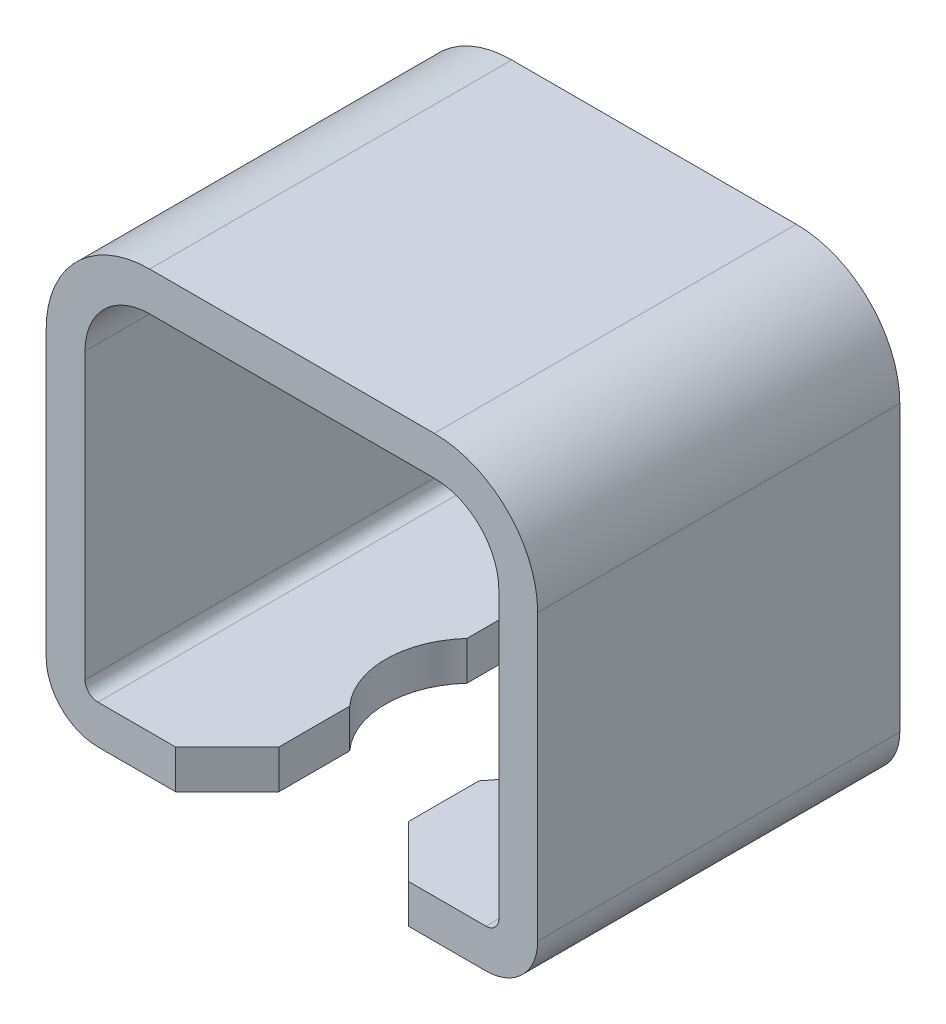
ISO-10303-21;
HEADER;
FILE_DESCRIPTION(('STEP AP214'),'2;1');
FILE_NAME('part.step','',(''),(''),'','','');
FILE_SCHEMA(('AUTOMOTIVE_DESIGN { 1 0 10303 214 1 1 1 1 }'));
ENDSEC;
DATA;
#1=APPLICATION_CONTEXT('core data for automotive mechanical design processes');
#2=APPLICATION_PROTOCOL_DEFINITION('international standard','automotive_design',2000,#1);
#3=PRODUCT_CONTEXT('',#1,'mechanical');
#4=PRODUCT('Part','Part','',(#3));
#5=PRODUCT_RELATED_PRODUCT_CATEGORY('part','',(#4));
#6=PRODUCT_DEFINITION_FORMATION('','',#4);
#7=PRODUCT_DEFINITION_CONTEXT('part definition',#1,'design');
#8=PRODUCT_DEFINITION('design','',#6,#7);
#9=PRODUCT_DEFINITION_SHAPE('','',#8);
#10=(LENGTH_UNIT() NAMED_UNIT(*) SI_UNIT(.MILLI.,.METRE.));
#11=(NAMED_UNIT(*) PLANE_ANGLE_UNIT() SI_UNIT($,.RADIAN.));
#12=(NAMED_UNIT(*) SI_UNIT($,.STERADIAN.) SOLID_ANGLE_UNIT());
#13=UNCERTAINTY_MEASURE_WITH_UNIT(LENGTH_MEASURE(1.E-05),#10,'distance_accuracy_value','');
#14=(GEOMETRIC_REPRESENTATION_CONTEXT(3) GLOBAL_UNCERTAINTY_ASSIGNED_CONTEXT((#13)) GLOBAL_UNIT_ASSIGNED_CONTEXT((#10,
#11,#12)) REPRESENTATION_CONTEXT('',''));
#15=CARTESIAN_POINT('',(0.,0.,0.));
#16=DIRECTION('',(0.,0.,1.));
#17=DIRECTION('',(1.,0.,0.));
#18=AXIS2_PLACEMENT_3D('',#15,#16,#17);
#19=CARTESIAN_POINT('',(-5.5,4.5,-7.));
#20=DIRECTION('',(0.,0.,1.));
#21=DIRECTION('',(1.,0.,0.));
#22=AXIS2_PLACEMENT_3D('',#19,#20,#21);
#23=PLANE('',#22);
#24=DIRECTION('',(1.,0.,0.));
#25=VECTOR('',#24,1.);
#26=CARTESIAN_POINT('',(7.49999999999999,-7.,-7.));
#27=LINE('',#26,#25);
#28=CARTESIAN_POINT('',(-7.49999999999999,-7.,-7.));
#29=VERTEX_POINT('',#28);
#30=CARTESIAN_POINT('',(-4.5,-7.,-7.));
#31=VERTEX_POINT('',#30);
#32=EDGE_CURVE('E379',#29,#31,#27,.T.);
#33=ORIENTED_EDGE('',*,*,#32,.T.);
#34=DIRECTION('',(0.,-1.,0.));
#35=VECTOR('',#34,1.);
#36=CARTESIAN_POINT('',(-4.5,4.5,-7.));
#37=LINE('',#36,#35);
#38=CARTESIAN_POINT('',(-4.5,-8.5,-7.));
#39=VERTEX_POINT('',#38);
#40=EDGE_CURVE('E513',#31,#39,#37,.T.);
#41=ORIENTED_EDGE('',*,*,#40,.T.);
#42=DIRECTION('',(1.,0.,0.));
#43=VECTOR('',#42,1.);
#44=CARTESIAN_POINT('',(7.49999999999999,-8.5,-7.));
#45=LINE('',#44,#43);
#46=CARTESIAN_POINT('',(-7.49999999999998,-8.5,-7.));
#47=VERTEX_POINT('',#46);
#48=EDGE_CURVE('E464',#47,#39,#45,.T.);
#49=ORIENTED_EDGE('',*,*,#48,.F.);
#50=CARTESIAN_POINT('',(-7.5,-6.5,-7.));
#51=DIRECTION('',(0.,0.,1.));
#52=DIRECTION('',(-1.,0.,0.));
#53=AXIS2_PLACEMENT_3D('',#50,#51,#52);
#54=CIRCLE('',#53,2.);
#55=CARTESIAN_POINT('',(-9.5,-6.5,-7.));
#56=VERTEX_POINT('',#55);
#57=EDGE_CURVE('E460',#56,#47,#54,.T.);
#58=ORIENTED_EDGE('',*,*,#57,.F.);
#59=DIRECTION('',(0.,-1.,0.));
#60=VECTOR('',#59,1.);
#61=CARTESIAN_POINT('',(-9.5,-6.49999999999999,-7.));
#62=LINE('',#61,#60);
#63=CARTESIAN_POINT('',(-9.5,4.49999999999997,-7.));
#64=VERTEX_POINT('',#63);
#65=EDGE_CURVE('E457',#64,#56,#62,.T.);
#66=ORIENTED_EDGE('',*,*,#65,.F.);
#67=CARTESIAN_POINT('',(-5.5,4.5,-7.));
#68=DIRECTION('',(0.,0.,1.));
#69=DIRECTION('',(1.,0.,0.));
#70=AXIS2_PLACEMENT_3D('',#67,#68,#69);
#71=CIRCLE('',#70,4.);
#72=CARTESIAN_POINT('',(-5.49999999999997,8.5,-7.));
#73=VERTEX_POINT('',#72);
#74=EDGE_CURVE('E424',#73,#64,#71,.T.);
#75=ORIENTED_EDGE('',*,*,#74,.F.);
#76=DIRECTION('',(-1.,0.,0.));
#77=VECTOR('',#76,1.);
#78=CARTESIAN_POINT('',(5.49999999999997,8.5,-7.));
#79=LINE('',#78,#77);
#80=CARTESIAN_POINT('',(5.49999999999997,8.5,-7.));
#81=VERTEX_POINT('',#80);
#82=EDGE_CURVE('E430',#81,#73,#79,.T.);
#83=ORIENTED_EDGE('',*,*,#82,.F.);
#84=CARTESIAN_POINT('',(5.5,4.5,-7.));
#85=DIRECTION('',(0.,0.,1.));
#86=DIRECTION('',(1.,0.,0.));
#87=AXIS2_PLACEMENT_3D('',#84,#85,#86);
#88=CIRCLE('',#87,4.);
#89=CARTESIAN_POINT('',(9.5,4.49999999999997,-7.));
#90=VERTEX_POINT('',#89);
#91=EDGE_CURVE('E474',#90,#81,#88,.T.);
#92=ORIENTED_EDGE('',*,*,#91,.F.);
#93=DIRECTION('',(0.,1.,0.));
#94=VECTOR('',#93,1.);
#95=CARTESIAN_POINT('',(9.5,-6.49999999999999,-7.));
#96=LINE('',#95,#94);
#97=CARTESIAN_POINT('',(9.5,-6.49999999999999,-7.));
#98=VERTEX_POINT('',#97);
#99=EDGE_CURVE('E471',#98,#90,#96,.T.);
#100=ORIENTED_EDGE('',*,*,#99,.F.);
#101=CARTESIAN_POINT('',(7.5,-6.5,-7.));
#102=DIRECTION('',(0.,0.,1.));
#103=DIRECTION('',(1.,0.,0.));
#104=AXIS2_PLACEMENT_3D('',#101,#102,#103);
#105=CIRCLE('',#104,2.);
#106=CARTESIAN_POINT('',(7.49999999999999,-8.5,-7.));
#107=VERTEX_POINT('',#106);
#108=EDGE_CURVE('E468',#107,#98,#105,.T.);
#109=ORIENTED_EDGE('',*,*,#108,.F.);
#110=CARTESIAN_POINT('',(4.50000000000001,-8.5,-7.));
#111=VERTEX_POINT('',#110);
#112=EDGE_CURVE('E463',#111,#107,#45,.T.);
#113=ORIENTED_EDGE('',*,*,#112,.F.);
#114=DIRECTION('',(0.,1.,0.));
#115=VECTOR('',#114,1.);
#116=CARTESIAN_POINT('',(4.50000000000001,-7.,-7.));
#117=LINE('',#116,#115);
#118=CARTESIAN_POINT('',(4.50000000000001,-7.,-7.));
#119=VERTEX_POINT('',#118);
#120=EDGE_CURVE('E510',#111,#119,#117,.T.);
#121=ORIENTED_EDGE('',*,*,#120,.T.);
#122=CARTESIAN_POINT('',(7.49999999999999,-7.,-7.));
#123=VERTEX_POINT('',#122);
#124=EDGE_CURVE('E378',#119,#123,#27,.T.);
#125=ORIENTED_EDGE('',*,*,#124,.T.);
#126=CARTESIAN_POINT('',(7.5,-6.5,-7.));
#127=DIRECTION('',(0.,0.,1.));
#128=DIRECTION('',(1.,0.,0.));
#129=AXIS2_PLACEMENT_3D('',#126,#127,#128);
#130=CIRCLE('',#129,0.5);
#131=CARTESIAN_POINT('',(8.,-6.5,-7.));
#132=VERTEX_POINT('',#131);
#133=EDGE_CURVE('E383',#123,#132,#130,.T.);
#134=ORIENTED_EDGE('',*,*,#133,.T.);
#135=DIRECTION('',(0.,1.,0.));
#136=VECTOR('',#135,1.);
#137=CARTESIAN_POINT('',(8.,-6.49999999999999,-7.));
#138=LINE('',#137,#136);
#139=CARTESIAN_POINT('',(8.,4.49999999999997,-7.));
#140=VERTEX_POINT('',#139);
#141=EDGE_CURVE('E387',#132,#140,#138,.T.);
#142=ORIENTED_EDGE('',*,*,#141,.T.);
#143=CARTESIAN_POINT('',(5.5,4.5,-7.));
#144=DIRECTION('',(0.,0.,1.));
#145=DIRECTION('',(1.,0.,0.));
#146=AXIS2_PLACEMENT_3D('',#143,#144,#145);
#147=CIRCLE('',#146,2.5);
#148=CARTESIAN_POINT('',(5.49999999999998,7.,-7.));
#149=VERTEX_POINT('',#148);
#150=EDGE_CURVE('E391',#140,#149,#147,.T.);
#151=ORIENTED_EDGE('',*,*,#150,.T.);
#152=DIRECTION('',(-1.,0.,0.));
#153=VECTOR('',#152,1.);
#154=CARTESIAN_POINT('',(5.49999999999997,7.,-7.));
#155=LINE('',#154,#153);
#156=CARTESIAN_POINT('',(-5.49999999999997,7.,-7.));
#157=VERTEX_POINT('',#156);
#158=EDGE_CURVE('E342',#149,#157,#155,.T.);
#159=ORIENTED_EDGE('',*,*,#158,.T.);
#160=CARTESIAN_POINT('',(-5.5,4.5,-7.));
#161=DIRECTION('',(0.,0.,1.));
#162=DIRECTION('',(1.,0.,0.));
#163=AXIS2_PLACEMENT_3D('',#160,#161,#162);
#164=CIRCLE('',#163,2.5);
#165=CARTESIAN_POINT('',(-8.,4.49999999999997,-7.));
#166=VERTEX_POINT('',#165);
#167=EDGE_CURVE('E277',#157,#166,#164,.T.);
#168=ORIENTED_EDGE('',*,*,#167,.T.);
#169=DIRECTION('',(0.,-1.,0.));
#170=VECTOR('',#169,1.);
#171=CARTESIAN_POINT('',(-8.,-6.49999999999999,-7.));
#172=LINE('',#171,#170);
#173=CARTESIAN_POINT('',(-8.,-6.5,-7.));
#174=VERTEX_POINT('',#173);
#175=EDGE_CURVE('E370',#166,#174,#172,.T.);
#176=ORIENTED_EDGE('',*,*,#175,.T.);
#177=CARTESIAN_POINT('',(-7.5,-6.5,-7.));
#178=DIRECTION('',(0.,0.,1.));
#179=DIRECTION('',(1.,0.,0.));
#180=AXIS2_PLACEMENT_3D('',#177,#178,#179);
#181=CIRCLE('',#180,0.5);
#182=EDGE_CURVE('E374',#174,#29,#181,.T.);
#183=ORIENTED_EDGE('',*,*,#182,.T.);
#184=EDGE_LOOP('',(#33,#41,#49,#58,#66,#75,#83,#92,#100,#109,#113,#121,#125,#134,#142,#151,#159,
#168,#176,#183));
#185=FACE_BOUND('',#184,.T.);
#186=ADVANCED_FACE('F87',(#185),#23,.F.);
#187=CARTESIAN_POINT('',(7.49999999999999,-8.5,7.));
#188=DIRECTION('',(0.,1.,0.));
#189=DIRECTION('',(-1.,0.,0.));
#190=AXIS2_PLACEMENT_3D('',#187,#188,#189);
#191=PLANE('',#190);
#192=DIRECTION('',(0.,0.,-1.));
#193=VECTOR('',#192,1.);
#194=CARTESIAN_POINT('',(2.5,-8.5,0.));
#195=LINE('',#194,#193);
#196=CARTESIAN_POINT('',(2.5,-8.5,-2.26729464340213));
#197=VERTEX_POINT('',#196);
#198=CARTESIAN_POINT('',(2.5,-8.5,-5.));
#199=VERTEX_POINT('',#198);
#200=EDGE_CURVE('E289',#197,#199,#195,.T.);
#201=ORIENTED_EDGE('',*,*,#200,.T.);
#202=DIRECTION('',(0.707106781186549,0.,-0.707106781186546));
#203=VECTOR('',#202,1.);
#204=CARTESIAN_POINT('',(2.5,-8.5,-5.));
#205=LINE('',#204,#203);
#206=EDGE_CURVE('E539',#199,#111,#205,.T.);
#207=ORIENTED_EDGE('',*,*,#206,.T.);
#208=ORIENTED_EDGE('',*,*,#112,.T.);
#209=DIRECTION('',(0.,0.,-1.));
#210=VECTOR('',#209,1.);
#211=CARTESIAN_POINT('',(7.49999999999999,-8.5,7.));
#212=LINE('',#211,#210);
#213=CARTESIAN_POINT('',(7.49999999999999,-8.5,7.));
#214=VERTEX_POINT('',#213);
#215=EDGE_CURVE('E494',#214,#107,#212,.T.);
#216=ORIENTED_EDGE('',*,*,#215,.F.);
#217=DIRECTION('',(1.,0.,0.));
#218=VECTOR('',#217,1.);
#219=CARTESIAN_POINT('',(7.49999999999999,-8.5,7.));
#220=LINE('',#219,#218);
#221=CARTESIAN_POINT('',(4.5,-8.5,7.));
#222=VERTEX_POINT('',#221);
#223=EDGE_CURVE('E436',#222,#214,#220,.T.);
#224=ORIENTED_EDGE('',*,*,#223,.F.);
#225=DIRECTION('',(0.707106781186546,0.,0.707106781186549));
#226=VECTOR('',#225,1.);
#227=CARTESIAN_POINT('',(4.5,-8.5,7.));
#228=LINE('',#227,#226);
#229=CARTESIAN_POINT('',(2.5,-8.5,4.99999999999999));
#230=VERTEX_POINT('',#229);
#231=EDGE_CURVE('E536',#222,#230,#228,.F.);
#232=ORIENTED_EDGE('',*,*,#231,.T.);
#233=DIRECTION('',(0.,0.,-1.));
#234=VECTOR('',#233,1.);
#235=CARTESIAN_POINT('',(2.5,-8.5,0.));
#236=LINE('',#235,#234);
#237=CARTESIAN_POINT('',(2.5,-8.5,2.26729464340213));
#238=VERTEX_POINT('',#237);
#239=EDGE_CURVE('E313',#230,#238,#236,.T.);
#240=ORIENTED_EDGE('',*,*,#239,.T.);
#241=CARTESIAN_POINT('',(0.,-8.5,0.));
#242=DIRECTION('',(0.,-1.,0.));
#243=DIRECTION('',(1.,0.,0.));
#244=AXIS2_PLACEMENT_3D('',#241,#242,#243);
#245=CIRCLE('',#244,3.375);
#246=EDGE_CURVE('E286',#197,#238,#245,.T.);
#247=ORIENTED_EDGE('',*,*,#246,.F.);
#248=EDGE_LOOP('',(#201,#207,#208,#216,#224,#232,#240,#247));
#249=FACE_BOUND('',#248,.T.);
#250=ADVANCED_FACE('F635',(#249),#191,.F.);
#251=CARTESIAN_POINT('',(7.49999999999999,-7.,7.));
#252=DIRECTION('',(0.,1.,0.));
#253=DIRECTION('',(-1.,0.,0.));
#254=AXIS2_PLACEMENT_3D('',#251,#252,#253);
#255=PLANE('',#254);
#256=ORIENTED_EDGE('',*,*,#124,.F.);
#257=DIRECTION('',(-0.707106781186549,0.,0.707106781186546));
#258=VECTOR('',#257,1.);
#259=CARTESIAN_POINT('',(-0.999999999999996,-7.,-1.50000000000003));
#260=LINE('',#259,#258);
#261=CARTESIAN_POINT('',(2.5,-7.,-5.));
#262=VERTEX_POINT('',#261);
#263=EDGE_CURVE('E544',#119,#262,#260,.T.);
#264=ORIENTED_EDGE('',*,*,#263,.T.);
#265=DIRECTION('',(0.,0.,-1.));
#266=VECTOR('',#265,1.);
#267=CARTESIAN_POINT('',(2.5,-7.,0.));
#268=LINE('',#267,#266);
#269=CARTESIAN_POINT('',(2.5,-7.,-2.26729464340213));
#270=VERTEX_POINT('',#269);
#271=EDGE_CURVE('E294',#270,#262,#268,.T.);
#272=ORIENTED_EDGE('',*,*,#271,.F.);
#273=CARTESIAN_POINT('',(0.,-7.,0.));
#274=DIRECTION('',(0.,1.,0.));
#275=DIRECTION('',(-1.,0.,0.));
#276=AXIS2_PLACEMENT_3D('',#273,#274,#275);
#277=CIRCLE('',#276,3.375);
#278=CARTESIAN_POINT('',(2.5,-7.,2.26729464340213));
#279=VERTEX_POINT('',#278);
#280=EDGE_CURVE('E283',#270,#279,#277,.F.);
#281=ORIENTED_EDGE('',*,*,#280,.T.);
#282=DIRECTION('',(0.,0.,-1.));
#283=VECTOR('',#282,1.);
#284=CARTESIAN_POINT('',(2.5,-7.,0.));
#285=LINE('',#284,#283);
#286=CARTESIAN_POINT('',(2.5,-7.,4.99999999999999));
#287=VERTEX_POINT('',#286);
#288=EDGE_CURVE('E270',#287,#279,#285,.T.);
#289=ORIENTED_EDGE('',*,*,#288,.F.);
#290=DIRECTION('',(-0.707106781186546,0.,-0.707106781186549));
#291=VECTOR('',#290,1.);
#292=CARTESIAN_POINT('',(5.99999999999999,-7.,8.49999999999999));
#293=LINE('',#292,#291);
#294=CARTESIAN_POINT('',(4.5,-7.,7.));
#295=VERTEX_POINT('',#294);
#296=EDGE_CURVE('E103',#287,#295,#293,.F.);
#297=ORIENTED_EDGE('',*,*,#296,.T.);
#298=DIRECTION('',(1.,0.,0.));
#299=VECTOR('',#298,1.);
#300=CARTESIAN_POINT('',(7.49999999999999,-7.,7.));
#301=LINE('',#300,#299);
#302=CARTESIAN_POINT('',(7.49999999999999,-7.,7.));
#303=VERTEX_POINT('',#302);
#304=EDGE_CURVE('E348',#295,#303,#301,.T.);
#305=ORIENTED_EDGE('',*,*,#304,.T.);
#306=DIRECTION('',(0.,0.,-1.));
#307=VECTOR('',#306,1.);
#308=CARTESIAN_POINT('',(7.49999999999999,-7.,7.));
#309=LINE('',#308,#307);
#310=EDGE_CURVE('E410',#303,#123,#309,.T.);
#311=ORIENTED_EDGE('',*,*,#310,.T.);
#312=EDGE_LOOP('',(#256,#264,#272,#281,#289,#297,#305,#311));
#313=FACE_BOUND('',#312,.T.);
#314=ADVANCED_FACE('F292',(#313),#255,.T.);
#315=CARTESIAN_POINT('',(-5.5,4.5,7.));
#316=DIRECTION('',(0.,0.,1.));
#317=DIRECTION('',(1.,0.,0.));
#318=AXIS2_PLACEMENT_3D('',#315,#316,#317);
#319=PLANE('',#318);
#320=CARTESIAN_POINT('',(-7.49999999999998,-8.5,7.));
#321=VERTEX_POINT('',#320);
#322=CARTESIAN_POINT('',(-4.50000000000001,-8.5,7.));
#323=VERTEX_POINT('',#322);
#324=EDGE_CURVE('E437',#321,#323,#220,.T.);
#325=ORIENTED_EDGE('',*,*,#324,.T.);
#326=DIRECTION('',(0.,1.,0.));
#327=VECTOR('',#326,1.);
#328=CARTESIAN_POINT('',(-4.50000000000001,-7.,7.));
#329=LINE('',#328,#327);
#330=CARTESIAN_POINT('',(-4.50000000000001,-7.,7.));
#331=VERTEX_POINT('',#330);
#332=EDGE_CURVE('E96',#323,#331,#329,.T.);
#333=ORIENTED_EDGE('',*,*,#332,.T.);
#334=CARTESIAN_POINT('',(-7.49999999999999,-7.,7.));
#335=VERTEX_POINT('',#334);
#336=EDGE_CURVE('E349',#335,#331,#301,.T.);
#337=ORIENTED_EDGE('',*,*,#336,.F.);
#338=CARTESIAN_POINT('',(-7.5,-6.5,7.));
#339=DIRECTION('',(0.,0.,1.));
#340=DIRECTION('',(1.,0.,0.));
#341=AXIS2_PLACEMENT_3D('',#338,#339,#340);
#342=CIRCLE('',#341,0.5);
#343=CARTESIAN_POINT('',(-8.,-6.5,7.));
#344=VERTEX_POINT('',#343);
#345=EDGE_CURVE('E345',#344,#335,#342,.T.);
#346=ORIENTED_EDGE('',*,*,#345,.F.);
#347=DIRECTION('',(0.,-1.,0.));
#348=VECTOR('',#347,1.);
#349=CARTESIAN_POINT('',(-8.,-6.49999999999999,7.));
#350=LINE('',#349,#348);
#351=CARTESIAN_POINT('',(-8.,4.49999999999997,7.));
#352=VERTEX_POINT('',#351);
#353=EDGE_CURVE('E341',#352,#344,#350,.T.);
#354=ORIENTED_EDGE('',*,*,#353,.F.);
#355=CARTESIAN_POINT('',(-5.5,4.5,7.));
#356=DIRECTION('',(0.,0.,1.));
#357=DIRECTION('',(1.,0.,0.));
#358=AXIS2_PLACEMENT_3D('',#355,#356,#357);
#359=CIRCLE('',#358,2.5);
#360=CARTESIAN_POINT('',(-5.49999999999997,7.,7.));
#361=VERTEX_POINT('',#360);
#362=EDGE_CURVE('E338',#361,#352,#359,.T.);
#363=ORIENTED_EDGE('',*,*,#362,.F.);
#364=DIRECTION('',(-1.,0.,0.));
#365=VECTOR('',#364,1.);
#366=CARTESIAN_POINT('',(5.49999999999997,7.,7.));
#367=LINE('',#366,#365);
#368=CARTESIAN_POINT('',(5.49999999999998,7.,7.));
#369=VERTEX_POINT('',#368);
#370=EDGE_CURVE('E363',#369,#361,#367,.T.);
#371=ORIENTED_EDGE('',*,*,#370,.F.);
#372=CARTESIAN_POINT('',(5.5,4.5,7.));
#373=DIRECTION('',(0.,0.,1.));
#374=DIRECTION('',(1.,0.,0.));
#375=AXIS2_PLACEMENT_3D('',#372,#373,#374);
#376=CIRCLE('',#375,2.5);
#377=CARTESIAN_POINT('',(8.,4.49999999999997,7.));
#378=VERTEX_POINT('',#377);
#379=EDGE_CURVE('E359',#378,#369,#376,.T.);
#380=ORIENTED_EDGE('',*,*,#379,.F.);
#381=DIRECTION('',(0.,1.,0.));
#382=VECTOR('',#381,1.);
#383=CARTESIAN_POINT('',(8.,-6.49999999999999,7.));
#384=LINE('',#383,#382);
#385=CARTESIAN_POINT('',(8.,-6.5,7.));
#386=VERTEX_POINT('',#385);
#387=EDGE_CURVE('E356',#386,#378,#384,.T.);
#388=ORIENTED_EDGE('',*,*,#387,.F.);
#389=CARTESIAN_POINT('',(7.5,-6.5,7.));
#390=DIRECTION('',(0.,0.,1.));
#391=DIRECTION('',(1.,0.,0.));
#392=AXIS2_PLACEMENT_3D('',#389,#390,#391);
#393=CIRCLE('',#392,0.5);
#394=EDGE_CURVE('E353',#303,#386,#393,.T.);
#395=ORIENTED_EDGE('',*,*,#394,.F.);
#396=ORIENTED_EDGE('',*,*,#304,.F.);
#397=DIRECTION('',(0.,-1.,0.));
#398=VECTOR('',#397,1.);
#399=CARTESIAN_POINT('',(4.5,4.5,7.));
#400=LINE('',#399,#398);
#401=EDGE_CURVE('E551',#295,#222,#400,.T.);
#402=ORIENTED_EDGE('',*,*,#401,.T.);
#403=ORIENTED_EDGE('',*,*,#223,.T.);
#404=CARTESIAN_POINT('',(7.5,-6.5,7.));
#405=DIRECTION('',(0.,0.,1.));
#406=DIRECTION('',(1.,0.,0.));
#407=AXIS2_PLACEMENT_3D('',#404,#405,#406);
#408=CIRCLE('',#407,2.);
#409=CARTESIAN_POINT('',(9.5,-6.49999999999999,7.));
#410=VERTEX_POINT('',#409);
#411=EDGE_CURVE('E441',#214,#410,#408,.T.);
#412=ORIENTED_EDGE('',*,*,#411,.T.);
#413=DIRECTION('',(0.,1.,0.));
#414=VECTOR('',#413,1.);
#415=CARTESIAN_POINT('',(9.5,-6.49999999999999,7.));
#416=LINE('',#415,#414);
#417=CARTESIAN_POINT('',(9.5,4.49999999999997,7.));
#418=VERTEX_POINT('',#417);
#419=EDGE_CURVE('E444',#410,#418,#416,.T.);
#420=ORIENTED_EDGE('',*,*,#419,.T.);
#421=CARTESIAN_POINT('',(5.5,4.5,7.));
#422=DIRECTION('',(0.,0.,1.));
#423=DIRECTION('',(1.,0.,0.));
#424=AXIS2_PLACEMENT_3D('',#421,#422,#423);
#425=CIRCLE('',#424,4.);
#426=CARTESIAN_POINT('',(5.49999999999997,8.5,7.));
#427=VERTEX_POINT('',#426);
#428=EDGE_CURVE('E447',#418,#427,#425,.T.);
#429=ORIENTED_EDGE('',*,*,#428,.T.);
#430=DIRECTION('',(-1.,0.,0.));
#431=VECTOR('',#430,1.);
#432=CARTESIAN_POINT('',(5.49999999999997,8.5,7.));
#433=LINE('',#432,#431);
#434=CARTESIAN_POINT('',(-5.49999999999997,8.5,7.));
#435=VERTEX_POINT('',#434);
#436=EDGE_CURVE('E450',#427,#435,#433,.T.);
#437=ORIENTED_EDGE('',*,*,#436,.T.);
#438=CARTESIAN_POINT('',(-5.5,4.5,7.));
#439=DIRECTION('',(0.,0.,1.));
#440=DIRECTION('',(1.,0.,0.));
#441=AXIS2_PLACEMENT_3D('',#438,#439,#440);
#442=CIRCLE('',#441,4.);
#443=CARTESIAN_POINT('',(-9.5,4.49999999999997,7.));
#444=VERTEX_POINT('',#443);
#445=EDGE_CURVE('E425',#435,#444,#442,.T.);
#446=ORIENTED_EDGE('',*,*,#445,.T.);
#447=DIRECTION('',(0.,-1.,0.));
#448=VECTOR('',#447,1.);
#449=CARTESIAN_POINT('',(-9.5,-6.49999999999999,7.));
#450=LINE('',#449,#448);
#451=CARTESIAN_POINT('',(-9.5,-6.5,7.));
#452=VERTEX_POINT('',#451);
#453=EDGE_CURVE('E429',#444,#452,#450,.T.);
#454=ORIENTED_EDGE('',*,*,#453,.T.);
#455=CARTESIAN_POINT('',(-7.5,-6.5,7.));
#456=DIRECTION('',(0.,0.,1.));
#457=DIRECTION('',(-1.,0.,0.));
#458=AXIS2_PLACEMENT_3D('',#455,#456,#457);
#459=CIRCLE('',#458,2.);
#460=EDGE_CURVE('E433',#452,#321,#459,.T.);
#461=ORIENTED_EDGE('',*,*,#460,.T.);
#462=EDGE_LOOP('',(#325,#333,#337,#346,#354,#363,#371,#380,#388,#395,#396,#402,#403,#412,#420,
#429,#437,#446,#454,#461));
#463=FACE_BOUND('',#462,.T.);
#464=ADVANCED_FACE('F558',(#463),#319,.T.);
#465=CARTESIAN_POINT('',(-5.5,4.5,7.));
#466=DIRECTION('',(0.,0.,-1.));
#467=DIRECTION('',(-1.,0.,0.));
#468=AXIS2_PLACEMENT_3D('',#465,#466,#467);
#469=CYLINDRICAL_SURFACE('',#468,4.);
#470=ORIENTED_EDGE('',*,*,#74,.T.);
#471=DIRECTION('',(0.,0.,-1.));
#472=VECTOR('',#471,1.);
#473=CARTESIAN_POINT('',(-9.5,4.49999999999997,7.));
#474=LINE('',#473,#472);
#475=EDGE_CURVE('E506',#444,#64,#474,.T.);
#476=ORIENTED_EDGE('',*,*,#475,.F.);
#477=ORIENTED_EDGE('',*,*,#445,.F.);
#478=DIRECTION('',(0.,0.,-1.));
#479=VECTOR('',#478,1.);
#480=CARTESIAN_POINT('',(-5.49999999999997,8.5,7.));
#481=LINE('',#480,#479);
#482=EDGE_CURVE('E453',#435,#73,#481,.T.);
#483=ORIENTED_EDGE('',*,*,#482,.T.);
#484=EDGE_LOOP('',(#470,#476,#477,#483));
#485=FACE_BOUND('',#484,.T.);
#486=ADVANCED_FACE('F603',(#485),#469,.T.);
#487=CARTESIAN_POINT('',(-9.5,-6.49999999999999,7.));
#488=DIRECTION('',(1.,0.,0.));
#489=DIRECTION('',(0.,0.,-1.));
#490=AXIS2_PLACEMENT_3D('',#487,#488,#489);
#491=PLANE('',#490);
#492=ORIENTED_EDGE('',*,*,#65,.T.);
#493=DIRECTION('',(0.,0.,-1.));
#494=VECTOR('',#493,1.);
#495=CARTESIAN_POINT('',(-9.5,-6.5,7.));
#496=LINE('',#495,#494);
#497=EDGE_CURVE('E502',#452,#56,#496,.T.);
#498=ORIENTED_EDGE('',*,*,#497,.F.);
#499=ORIENTED_EDGE('',*,*,#453,.F.);
#500=ORIENTED_EDGE('',*,*,#475,.T.);
#501=EDGE_LOOP('',(#492,#498,#499,#500));
#502=FACE_BOUND('',#501,.T.);
#503=ADVANCED_FACE('F600',(#502),#491,.F.);
#504=CARTESIAN_POINT('',(-7.5,-6.5,7.));
#505=DIRECTION('',(0.,0.,-1.));
#506=DIRECTION('',(-1.,0.,0.));
#507=AXIS2_PLACEMENT_3D('',#504,#505,#506);
#508=CYLINDRICAL_SURFACE('',#507,2.);
#509=ORIENTED_EDGE('',*,*,#57,.T.);
#510=DIRECTION('',(0.,0.,-1.));
#511=VECTOR('',#510,1.);
#512=CARTESIAN_POINT('',(-7.49999999999998,-8.5,7.));
#513=LINE('',#512,#511);
#514=EDGE_CURVE('E498',#321,#47,#513,.T.);
#515=ORIENTED_EDGE('',*,*,#514,.F.);
#516=ORIENTED_EDGE('',*,*,#460,.F.);
#517=ORIENTED_EDGE('',*,*,#497,.T.);
#518=EDGE_LOOP('',(#509,#515,#516,#517));
#519=FACE_BOUND('',#518,.T.);
#520=ADVANCED_FACE('F594',(#519),#508,.T.);
#521=ORIENTED_EDGE('',*,*,#48,.T.);
#522=DIRECTION('',(-0.707106781186546,0.,-0.707106781186549));
#523=VECTOR('',#522,1.);
#524=CARTESIAN_POINT('',(-4.5,-8.5,-7.));
#525=LINE('',#524,#523);
#526=CARTESIAN_POINT('',(-2.5,-8.5,-4.99999999999999));
#527=VERTEX_POINT('',#526);
#528=EDGE_CURVE('E520',#39,#527,#525,.F.);
#529=ORIENTED_EDGE('',*,*,#528,.T.);
#530=DIRECTION('',(0.,0.,-1.));
#531=VECTOR('',#530,1.);
#532=CARTESIAN_POINT('',(-2.5,-8.5,0.));
#533=LINE('',#532,#531);
#534=CARTESIAN_POINT('',(-2.5,-8.5,-2.26729464340213));
#535=VERTEX_POINT('',#534);
#536=EDGE_CURVE('E323',#535,#527,#533,.T.);
#537=ORIENTED_EDGE('',*,*,#536,.F.);
#538=CARTESIAN_POINT('',(0.,-8.5,0.));
#539=DIRECTION('',(0.,-1.,0.));
#540=DIRECTION('',(1.,0.,0.));
#541=AXIS2_PLACEMENT_3D('',#538,#539,#540);
#542=CIRCLE('',#541,3.375);
#543=CARTESIAN_POINT('',(-2.5,-8.5,2.26729464340213));
#544=VERTEX_POINT('',#543);
#545=EDGE_CURVE('E319',#544,#535,#542,.T.);
#546=ORIENTED_EDGE('',*,*,#545,.F.);
#547=DIRECTION('',(0.,0.,-1.));
#548=VECTOR('',#547,1.);
#549=CARTESIAN_POINT('',(-2.5,-8.5,0.));
#550=LINE('',#549,#548);
#551=CARTESIAN_POINT('',(-2.5,-8.5,4.99999999999999));
#552=VERTEX_POINT('',#551);
#553=EDGE_CURVE('E316',#552,#544,#550,.T.);
#554=ORIENTED_EDGE('',*,*,#553,.F.);
#555=DIRECTION('',(-0.707106781186549,0.,0.707106781186546));
#556=VECTOR('',#555,1.);
#557=CARTESIAN_POINT('',(-2.5,-8.5,4.99999999999999));
#558=LINE('',#557,#556);
#559=EDGE_CURVE('E517',#552,#323,#558,.T.);
#560=ORIENTED_EDGE('',*,*,#559,.T.);
#561=ORIENTED_EDGE('',*,*,#324,.F.);
#562=ORIENTED_EDGE('',*,*,#514,.T.);
#563=EDGE_LOOP('',(#521,#529,#537,#546,#554,#560,#561,#562));
#564=FACE_BOUND('',#563,.T.);
#565=ADVANCED_FACE('F576',(#564),#191,.F.);
#566=CARTESIAN_POINT('',(7.5,-6.5,7.));
#567=DIRECTION('',(0.,0.,-1.));
#568=DIRECTION('',(-1.,0.,0.));
#569=AXIS2_PLACEMENT_3D('',#566,#567,#568);
#570=CYLINDRICAL_SURFACE('',#569,2.);
#571=ORIENTED_EDGE('',*,*,#108,.T.);
#572=DIRECTION('',(0.,0.,-1.));
#573=VECTOR('',#572,1.);
#574=CARTESIAN_POINT('',(9.5,-6.49999999999999,7.));
#575=LINE('',#574,#573);
#576=EDGE_CURVE('E490',#410,#98,#575,.T.);
#577=ORIENTED_EDGE('',*,*,#576,.F.);
#578=ORIENTED_EDGE('',*,*,#411,.F.);
#579=ORIENTED_EDGE('',*,*,#215,.T.);
#580=EDGE_LOOP('',(#571,#577,#578,#579));
#581=FACE_BOUND('',#580,.T.);
#582=ADVANCED_FACE('F622',(#581),#570,.T.);
#583=CARTESIAN_POINT('',(9.5,-6.49999999999999,7.));
#584=DIRECTION('',(-1.,0.,0.));
#585=DIRECTION('',(0.,0.,1.));
#586=AXIS2_PLACEMENT_3D('',#583,#584,#585);
#587=PLANE('',#586);
#588=ORIENTED_EDGE('',*,*,#99,.T.);
#589=DIRECTION('',(0.,0.,-1.));
#590=VECTOR('',#589,1.);
#591=CARTESIAN_POINT('',(9.5,4.49999999999997,7.));
#592=LINE('',#591,#590);
#593=EDGE_CURVE('E486',#418,#90,#592,.T.);
#594=ORIENTED_EDGE('',*,*,#593,.F.);
#595=ORIENTED_EDGE('',*,*,#419,.F.);
#596=ORIENTED_EDGE('',*,*,#576,.T.);
#597=EDGE_LOOP('',(#588,#594,#595,#596));
#598=FACE_BOUND('',#597,.T.);
#599=ADVANCED_FACE('F618',(#598),#587,.F.);
#600=CARTESIAN_POINT('',(5.5,4.5,7.));
#601=DIRECTION('',(0.,0.,-1.));
#602=DIRECTION('',(-1.,0.,0.));
#603=AXIS2_PLACEMENT_3D('',#600,#601,#602);
#604=CYLINDRICAL_SURFACE('',#603,4.);
#605=ORIENTED_EDGE('',*,*,#91,.T.);
#606=DIRECTION('',(0.,0.,-1.));
#607=VECTOR('',#606,1.);
#608=CARTESIAN_POINT('',(5.49999999999997,8.5,7.));
#609=LINE('',#608,#607);
#610=EDGE_CURVE('E482',#427,#81,#609,.T.);
#611=ORIENTED_EDGE('',*,*,#610,.F.);
#612=ORIENTED_EDGE('',*,*,#428,.F.);
#613=ORIENTED_EDGE('',*,*,#593,.T.);
#614=EDGE_LOOP('',(#605,#611,#612,#613));
#615=FACE_BOUND('',#614,.T.);
#616=ADVANCED_FACE('F613',(#615),#604,.T.);
#617=CARTESIAN_POINT('',(5.49999999999997,8.5,7.));
#618=DIRECTION('',(0.,-1.,0.));
#619=DIRECTION('',(1.,0.,0.));
#620=AXIS2_PLACEMENT_3D('',#617,#618,#619);
#621=PLANE('',#620);
#622=ORIENTED_EDGE('',*,*,#82,.T.);
#623=ORIENTED_EDGE('',*,*,#482,.F.);
#624=ORIENTED_EDGE('',*,*,#436,.F.);
#625=ORIENTED_EDGE('',*,*,#610,.T.);
#626=EDGE_LOOP('',(#622,#623,#624,#625));
#627=FACE_BOUND('',#626,.T.);
#628=ADVANCED_FACE('F607',(#627),#621,.F.);
#629=CARTESIAN_POINT('',(-5.5,4.5,7.));
#630=DIRECTION('',(0.,0.,-1.));
#631=DIRECTION('',(-1.,0.,0.));
#632=AXIS2_PLACEMENT_3D('',#629,#630,#631);
#633=CYLINDRICAL_SURFACE('',#632,2.5);
#634=ORIENTED_EDGE('',*,*,#167,.F.);
#635=DIRECTION('',(0.,0.,-1.));
#636=VECTOR('',#635,1.);
#637=CARTESIAN_POINT('',(-5.49999999999997,7.,7.));
#638=LINE('',#637,#636);
#639=EDGE_CURVE('E366',#361,#157,#638,.T.);
#640=ORIENTED_EDGE('',*,*,#639,.F.);
#641=ORIENTED_EDGE('',*,*,#362,.T.);
#642=DIRECTION('',(0.,0.,-1.));
#643=VECTOR('',#642,1.);
#644=CARTESIAN_POINT('',(-8.,4.49999999999997,7.));
#645=LINE('',#644,#643);
#646=EDGE_CURVE('E420',#352,#166,#645,.T.);
#647=ORIENTED_EDGE('',*,*,#646,.T.);
#648=EDGE_LOOP('',(#634,#640,#641,#647));
#649=FACE_BOUND('',#648,.T.);
#650=ADVANCED_FACE('F664',(#649),#633,.F.);
#651=CARTESIAN_POINT('',(-8.,-6.49999999999999,7.));
#652=DIRECTION('',(1.,0.,0.));
#653=DIRECTION('',(0.,0.,-1.));
#654=AXIS2_PLACEMENT_3D('',#651,#652,#653);
#655=PLANE('',#654);
#656=ORIENTED_EDGE('',*,*,#175,.F.);
#657=ORIENTED_EDGE('',*,*,#646,.F.);
#658=ORIENTED_EDGE('',*,*,#353,.T.);
#659=DIRECTION('',(0.,0.,-1.));
#660=VECTOR('',#659,1.);
#661=CARTESIAN_POINT('',(-8.,-6.5,7.));
#662=LINE('',#661,#660);
#663=EDGE_CURVE('E417',#344,#174,#662,.T.);
#664=ORIENTED_EDGE('',*,*,#663,.T.);
#665=EDGE_LOOP('',(#656,#657,#658,#664));
#666=FACE_BOUND('',#665,.T.);
#667=ADVANCED_FACE('F669',(#666),#655,.T.);
#668=CARTESIAN_POINT('',(-7.5,-6.5,7.));
#669=DIRECTION('',(0.,0.,-1.));
#670=DIRECTION('',(-1.,0.,0.));
#671=AXIS2_PLACEMENT_3D('',#668,#669,#670);
#672=CYLINDRICAL_SURFACE('',#671,0.5);
#673=ORIENTED_EDGE('',*,*,#182,.F.);
#674=ORIENTED_EDGE('',*,*,#663,.F.);
#675=ORIENTED_EDGE('',*,*,#345,.T.);
#676=DIRECTION('',(0.,0.,-1.));
#677=VECTOR('',#676,1.);
#678=CARTESIAN_POINT('',(-7.49999999999999,-7.,7.));
#679=LINE('',#678,#677);
#680=EDGE_CURVE('E414',#335,#29,#679,.T.);
#681=ORIENTED_EDGE('',*,*,#680,.T.);
#682=EDGE_LOOP('',(#673,#674,#675,#681));
#683=FACE_BOUND('',#682,.T.);
#684=ADVANCED_FACE('F672',(#683),#672,.F.);
#685=DIRECTION('',(0.,0.,-1.));
#686=VECTOR('',#685,1.);
#687=CARTESIAN_POINT('',(-2.5,-7.,0.));
#688=LINE('',#687,#686);
#689=CARTESIAN_POINT('',(-2.5,-7.,-2.26729464340213));
#690=VERTEX_POINT('',#689);
#691=CARTESIAN_POINT('',(-2.5,-7.,-4.99999999999999));
#692=VERTEX_POINT('',#691);
#693=EDGE_CURVE('E307',#690,#692,#688,.T.);
#694=ORIENTED_EDGE('',*,*,#693,.T.);
#695=DIRECTION('',(0.707106781186546,0.,0.707106781186549));
#696=VECTOR('',#695,1.);
#697=CARTESIAN_POINT('',(8.49999999999996,-7.,6.00000000000003));
#698=LINE('',#697,#696);
#699=EDGE_CURVE('E529',#692,#31,#698,.F.);
#700=ORIENTED_EDGE('',*,*,#699,.T.);
#701=ORIENTED_EDGE('',*,*,#32,.F.);
#702=ORIENTED_EDGE('',*,*,#680,.F.);
#703=ORIENTED_EDGE('',*,*,#336,.T.);
#704=DIRECTION('',(0.707106781186549,0.,-0.707106781186546));
#705=VECTOR('',#704,1.);
#706=CARTESIAN_POINT('',(1.50000000000001,-7.,1.));
#707=LINE('',#706,#705);
#708=CARTESIAN_POINT('',(-2.5,-7.,4.99999999999999));
#709=VERTEX_POINT('',#708);
#710=EDGE_CURVE('E526',#331,#709,#707,.T.);
#711=ORIENTED_EDGE('',*,*,#710,.T.);
#712=DIRECTION('',(0.,0.,-1.));
#713=VECTOR('',#712,1.);
#714=CARTESIAN_POINT('',(-2.5,-7.,0.));
#715=LINE('',#714,#713);
#716=CARTESIAN_POINT('',(-2.5,-7.,2.26729464340213));
#717=VERTEX_POINT('',#716);
#718=EDGE_CURVE('E298',#709,#717,#715,.T.);
#719=ORIENTED_EDGE('',*,*,#718,.T.);
#720=CARTESIAN_POINT('',(0.,-7.,0.));
#721=DIRECTION('',(0.,1.,0.));
#722=DIRECTION('',(-1.,0.,0.));
#723=AXIS2_PLACEMENT_3D('',#720,#721,#722);
#724=CIRCLE('',#723,3.375);
#725=EDGE_CURVE('E303',#717,#690,#724,.F.);
#726=ORIENTED_EDGE('',*,*,#725,.T.);
#727=EDGE_LOOP('',(#694,#700,#701,#702,#703,#711,#719,#726));
#728=FACE_BOUND('',#727,.T.);
#729=ADVANCED_FACE('F565',(#728),#255,.T.);
#730=CARTESIAN_POINT('',(7.5,-6.5,7.));
#731=DIRECTION('',(0.,0.,-1.));
#732=DIRECTION('',(-1.,0.,0.));
#733=AXIS2_PLACEMENT_3D('',#730,#731,#732);
#734=CYLINDRICAL_SURFACE('',#733,0.5);
#735=ORIENTED_EDGE('',*,*,#133,.F.);
#736=ORIENTED_EDGE('',*,*,#310,.F.);
#737=ORIENTED_EDGE('',*,*,#394,.T.);
#738=DIRECTION('',(0.,0.,-1.));
#739=VECTOR('',#738,1.);
#740=CARTESIAN_POINT('',(8.,-6.5,7.));
#741=LINE('',#740,#739);
#742=EDGE_CURVE('E407',#386,#132,#741,.T.);
#743=ORIENTED_EDGE('',*,*,#742,.T.);
#744=EDGE_LOOP('',(#735,#736,#737,#743));
#745=FACE_BOUND('',#744,.T.);
#746=ADVANCED_FACE('F646',(#745),#734,.F.);
#747=CARTESIAN_POINT('',(8.,-6.49999999999999,7.));
#748=DIRECTION('',(-1.,0.,0.));
#749=DIRECTION('',(0.,0.,1.));
#750=AXIS2_PLACEMENT_3D('',#747,#748,#749);
#751=PLANE('',#750);
#752=ORIENTED_EDGE('',*,*,#141,.F.);
#753=ORIENTED_EDGE('',*,*,#742,.F.);
#754=ORIENTED_EDGE('',*,*,#387,.T.);
#755=DIRECTION('',(0.,0.,-1.));
#756=VECTOR('',#755,1.);
#757=CARTESIAN_POINT('',(8.,4.49999999999997,7.));
#758=LINE('',#757,#756);
#759=EDGE_CURVE('E404',#378,#140,#758,.T.);
#760=ORIENTED_EDGE('',*,*,#759,.T.);
#761=EDGE_LOOP('',(#752,#753,#754,#760));
#762=FACE_BOUND('',#761,.T.);
#763=ADVANCED_FACE('F651',(#762),#751,.T.);
#764=CARTESIAN_POINT('',(5.5,4.5,7.));
#765=DIRECTION('',(0.,0.,-1.));
#766=DIRECTION('',(-1.,0.,0.));
#767=AXIS2_PLACEMENT_3D('',#764,#765,#766);
#768=CYLINDRICAL_SURFACE('',#767,2.5);
#769=ORIENTED_EDGE('',*,*,#150,.F.);
#770=ORIENTED_EDGE('',*,*,#759,.F.);
#771=ORIENTED_EDGE('',*,*,#379,.T.);
#772=DIRECTION('',(0.,0.,-1.));
#773=VECTOR('',#772,1.);
#774=CARTESIAN_POINT('',(5.49999999999998,7.,7.));
#775=LINE('',#774,#773);
#776=EDGE_CURVE('E401',#369,#149,#775,.T.);
#777=ORIENTED_EDGE('',*,*,#776,.T.);
#778=EDGE_LOOP('',(#769,#770,#771,#777));
#779=FACE_BOUND('',#778,.T.);
#780=ADVANCED_FACE('F656',(#779),#768,.F.);
#781=CARTESIAN_POINT('',(5.49999999999997,7.,7.));
#782=DIRECTION('',(0.,-1.,0.));
#783=DIRECTION('',(1.,0.,0.));
#784=AXIS2_PLACEMENT_3D('',#781,#782,#783);
#785=PLANE('',#784);
#786=ORIENTED_EDGE('',*,*,#158,.F.);
#787=ORIENTED_EDGE('',*,*,#776,.F.);
#788=ORIENTED_EDGE('',*,*,#370,.T.);
#789=ORIENTED_EDGE('',*,*,#639,.T.);
#790=EDGE_LOOP('',(#786,#787,#788,#789));
#791=FACE_BOUND('',#790,.T.);
#792=ADVANCED_FACE('F660',(#791),#785,.T.);
#793=CARTESIAN_POINT('',(2.5,8.501,0.));
#794=DIRECTION('',(-1.,0.,0.));
#795=DIRECTION('',(0.,-1.,0.));
#796=AXIS2_PLACEMENT_3D('',#793,#794,#795);
#797=PLANE('',#796);
#798=ORIENTED_EDGE('',*,*,#239,.F.);
#799=DIRECTION('',(0.,1.,0.));
#800=VECTOR('',#799,1.);
#801=CARTESIAN_POINT('',(2.5,8.501,4.99999999999999));
#802=LINE('',#801,#800);
#803=EDGE_CURVE('E12',#230,#287,#802,.T.);
#804=ORIENTED_EDGE('',*,*,#803,.T.);
#805=ORIENTED_EDGE('',*,*,#288,.T.);
#806=DIRECTION('',(0.,-1.,0.));
#807=VECTOR('',#806,1.);
#808=CARTESIAN_POINT('',(2.5,8.501,2.26729464340213));
#809=LINE('',#808,#807);
#810=EDGE_CURVE('E273',#279,#238,#809,.T.);
#811=ORIENTED_EDGE('',*,*,#810,.T.);
#812=EDGE_LOOP('',(#798,#804,#805,#811));
#813=FACE_BOUND('',#812,.T.);
#814=ADVANCED_FACE('F272',(#813),#797,.T.);
#815=CARTESIAN_POINT('',(2.5,8.501,0.));
#816=DIRECTION('',(-1.,0.,0.));
#817=DIRECTION('',(0.,-1.,0.));
#818=AXIS2_PLACEMENT_3D('',#815,#816,#817);
#819=PLANE('',#818);
#820=ORIENTED_EDGE('',*,*,#271,.T.);
#821=DIRECTION('',(0.,-1.,0.));
#822=VECTOR('',#821,1.);
#823=CARTESIAN_POINT('',(2.5,-8.5,-5.));
#824=LINE('',#823,#822);
#825=EDGE_CURVE('E532',#262,#199,#824,.T.);
#826=ORIENTED_EDGE('',*,*,#825,.T.);
#827=ORIENTED_EDGE('',*,*,#200,.F.);
#828=DIRECTION('',(0.,-1.,0.));
#829=VECTOR('',#828,1.);
#830=CARTESIAN_POINT('',(2.5,8.501,-2.26729464340213));
#831=LINE('',#830,#829);
#832=EDGE_CURVE('E278',#270,#197,#831,.T.);
#833=ORIENTED_EDGE('',*,*,#832,.F.);
#834=EDGE_LOOP('',(#820,#826,#827,#833));
#835=FACE_BOUND('',#834,.T.);
#836=ADVANCED_FACE('F633',(#835),#819,.T.);
#837=CARTESIAN_POINT('',(0.,8.501,0.));
#838=DIRECTION('',(0.,-1.,0.));
#839=DIRECTION('',(1.,0.,0.));
#840=AXIS2_PLACEMENT_3D('',#837,#838,#839);
#841=CYLINDRICAL_SURFACE('',#840,3.375);
#842=ORIENTED_EDGE('',*,*,#832,.T.);
#843=ORIENTED_EDGE('',*,*,#246,.T.);
#844=ORIENTED_EDGE('',*,*,#810,.F.);
#845=ORIENTED_EDGE('',*,*,#280,.F.);
#846=EDGE_LOOP('',(#842,#843,#844,#845));
#847=FACE_BOUND('',#846,.T.);
#848=ADVANCED_FACE('F282',(#847),#841,.F.);
#849=CARTESIAN_POINT('',(-2.5,8.501,0.));
#850=DIRECTION('',(-1.,0.,0.));
#851=DIRECTION('',(0.,-1.,0.));
#852=AXIS2_PLACEMENT_3D('',#849,#850,#851);
#853=PLANE('',#852);
#854=ORIENTED_EDGE('',*,*,#536,.T.);
#855=DIRECTION('',(0.,1.,0.));
#856=VECTOR('',#855,1.);
#857=CARTESIAN_POINT('',(-2.5,8.501,-4.99999999999999));
#858=LINE('',#857,#856);
#859=EDGE_CURVE('E523',#527,#692,#858,.T.);
#860=ORIENTED_EDGE('',*,*,#859,.T.);
#861=ORIENTED_EDGE('',*,*,#693,.F.);
#862=DIRECTION('',(0.,-1.,0.));
#863=VECTOR('',#862,1.);
#864=CARTESIAN_POINT('',(-2.5,8.501,-2.26729464340213));
#865=LINE('',#864,#863);
#866=EDGE_CURVE('E332',#690,#535,#865,.T.);
#867=ORIENTED_EDGE('',*,*,#866,.T.);
#868=EDGE_LOOP('',(#854,#860,#861,#867));
#869=FACE_BOUND('',#868,.T.);
#870=ADVANCED_FACE('F745',(#869),#853,.F.);
#871=CARTESIAN_POINT('',(0.,8.501,0.));
#872=DIRECTION('',(0.,-1.,0.));
#873=DIRECTION('',(1.,0.,0.));
#874=AXIS2_PLACEMENT_3D('',#871,#872,#873);
#875=CYLINDRICAL_SURFACE('',#874,3.375);
#876=DIRECTION('',(0.,-1.,0.));
#877=VECTOR('',#876,1.);
#878=CARTESIAN_POINT('',(-2.5,8.501,2.26729464340213));
#879=LINE('',#878,#877);
#880=EDGE_CURVE('E288',#717,#544,#879,.T.);
#881=ORIENTED_EDGE('',*,*,#880,.T.);
#882=ORIENTED_EDGE('',*,*,#545,.T.);
#883=ORIENTED_EDGE('',*,*,#866,.F.);
#884=ORIENTED_EDGE('',*,*,#725,.F.);
#885=EDGE_LOOP('',(#881,#882,#883,#884));
#886=FACE_BOUND('',#885,.T.);
#887=ADVANCED_FACE('F579',(#886),#875,.F.);
#888=CARTESIAN_POINT('',(-2.5,8.501,0.));
#889=DIRECTION('',(-1.,0.,0.));
#890=DIRECTION('',(0.,-1.,0.));
#891=AXIS2_PLACEMENT_3D('',#888,#889,#890);
#892=PLANE('',#891);
#893=ORIENTED_EDGE('',*,*,#718,.F.);
#894=DIRECTION('',(0.,-1.,0.));
#895=VECTOR('',#894,1.);
#896=CARTESIAN_POINT('',(-2.5,-8.5,4.99999999999999));
#897=LINE('',#896,#895);
#898=EDGE_CURVE('E547',#709,#552,#897,.T.);
#899=ORIENTED_EDGE('',*,*,#898,.T.);
#900=ORIENTED_EDGE('',*,*,#553,.T.);
#901=ORIENTED_EDGE('',*,*,#880,.F.);
#902=EDGE_LOOP('',(#893,#899,#900,#901));
#903=FACE_BOUND('',#902,.T.);
#904=ADVANCED_FACE('F572',(#903),#892,.F.);
#905=CARTESIAN_POINT('',(-4.5,4.5,-7.));
#906=DIRECTION('',(-0.707106781186549,0.,0.707106781186546));
#907=DIRECTION('',(0.,-1.,0.));
#908=AXIS2_PLACEMENT_3D('',#905,#906,#907);
#909=PLANE('',#908);
#910=ORIENTED_EDGE('',*,*,#699,.F.);
#911=ORIENTED_EDGE('',*,*,#859,.F.);
#912=ORIENTED_EDGE('',*,*,#528,.F.);
#913=ORIENTED_EDGE('',*,*,#40,.F.);
#914=EDGE_LOOP('',(#910,#911,#912,#913));
#915=FACE_BOUND('',#914,.T.);
#916=ADVANCED_FACE('F587',(#915),#909,.F.);
#917=CARTESIAN_POINT('',(2.5,8.501,-5.));
#918=DIRECTION('',(-0.707106781186546,0.,-0.707106781186549));
#919=DIRECTION('',(0.,1.,0.));
#920=AXIS2_PLACEMENT_3D('',#917,#918,#919);
#921=PLANE('',#920);
#922=ORIENTED_EDGE('',*,*,#263,.F.);
#923=ORIENTED_EDGE('',*,*,#120,.F.);
#924=ORIENTED_EDGE('',*,*,#206,.F.);
#925=ORIENTED_EDGE('',*,*,#825,.F.);
#926=EDGE_LOOP('',(#922,#923,#924,#925));
#927=FACE_BOUND('',#926,.T.);
#928=ADVANCED_FACE('F630',(#927),#921,.T.);
#929=CARTESIAN_POINT('',(-2.5,8.501,4.99999999999999));
#930=DIRECTION('',(0.707106781186546,0.,0.707106781186549));
#931=DIRECTION('',(0.,1.,0.));
#932=AXIS2_PLACEMENT_3D('',#929,#930,#931);
#933=PLANE('',#932);
#934=ORIENTED_EDGE('',*,*,#710,.F.);
#935=ORIENTED_EDGE('',*,*,#332,.F.);
#936=ORIENTED_EDGE('',*,*,#559,.F.);
#937=ORIENTED_EDGE('',*,*,#898,.F.);
#938=EDGE_LOOP('',(#934,#935,#936,#937));
#939=FACE_BOUND('',#938,.T.);
#940=ADVANCED_FACE('F569',(#939),#933,.T.);
#941=CARTESIAN_POINT('',(4.5,4.5,7.));
#942=DIRECTION('',(0.707106781186549,0.,-0.707106781186546));
#943=DIRECTION('',(0.,-1.,0.));
#944=AXIS2_PLACEMENT_3D('',#941,#942,#943);
#945=PLANE('',#944);
#946=ORIENTED_EDGE('',*,*,#296,.F.);
#947=ORIENTED_EDGE('',*,*,#803,.F.);
#948=ORIENTED_EDGE('',*,*,#231,.F.);
#949=ORIENTED_EDGE('',*,*,#401,.F.);
#950=EDGE_LOOP('',(#946,#947,#948,#949));
#951=FACE_BOUND('',#950,.T.);
#952=ADVANCED_FACE('F89',(#951),#945,.F.);
#953=CLOSED_SHELL('',(#186,#250,#314,#464,#486,#503,#520,#565,#582,#599,#616,#628,#650,#667,
#684,#729,#746,#763,#780,#792,#814,#836,#848,#870,#887,#904,#916,#928,#940,#952));
#954=MANIFOLD_SOLID_BREP('B2',#953);
#955=ADVANCED_BREP_SHAPE_REPRESENTATION('',(#18,#954),#14);
#956=SHAPE_DEFINITION_REPRESENTATION(#9,#955);
ENDSEC;
END-ISO-10303-21;
